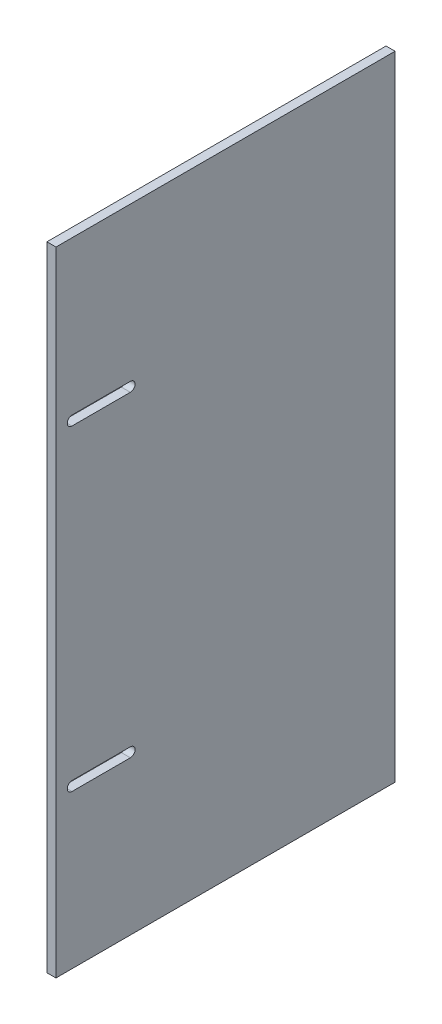
ISO-10303-21;
HEADER;
FILE_DESCRIPTION(('STEP AP214'),'2;1');
FILE_NAME('part.step','',(''),(''),'','','');
FILE_SCHEMA(('AUTOMOTIVE_DESIGN { 1 0 10303 214 1 1 1 1 }'));
ENDSEC;
DATA;
#1=APPLICATION_CONTEXT('core data for automotive mechanical design processes');
#2=APPLICATION_PROTOCOL_DEFINITION('international standard','automotive_design',2000,#1);
#3=PRODUCT_CONTEXT('',#1,'mechanical');
#4=PRODUCT('Part','Part','',(#3));
#5=PRODUCT_RELATED_PRODUCT_CATEGORY('part','',(#4));
#6=PRODUCT_DEFINITION_FORMATION('','',#4);
#7=PRODUCT_DEFINITION_CONTEXT('part definition',#1,'design');
#8=PRODUCT_DEFINITION('design','',#6,#7);
#9=PRODUCT_DEFINITION_SHAPE('','',#8);
#10=(LENGTH_UNIT() NAMED_UNIT(*) SI_UNIT(.MILLI.,.METRE.));
#11=(NAMED_UNIT(*) PLANE_ANGLE_UNIT() SI_UNIT($,.RADIAN.));
#12=(NAMED_UNIT(*) SI_UNIT($,.STERADIAN.) SOLID_ANGLE_UNIT());
#13=UNCERTAINTY_MEASURE_WITH_UNIT(LENGTH_MEASURE(1.E-05),#10,'distance_accuracy_value','');
#14=(GEOMETRIC_REPRESENTATION_CONTEXT(3) GLOBAL_UNCERTAINTY_ASSIGNED_CONTEXT((#13)) GLOBAL_UNIT_ASSIGNED_CONTEXT((#10,
#11,#12)) REPRESENTATION_CONTEXT('',''));
#15=CARTESIAN_POINT('',(0.,0.,0.));
#16=DIRECTION('',(0.,0.,1.));
#17=DIRECTION('',(1.,0.,0.));
#18=AXIS2_PLACEMENT_3D('',#15,#16,#17);
#19=CARTESIAN_POINT('',(4.,0.,0.));
#20=DIRECTION('',(1.,0.,0.));
#21=DIRECTION('',(0.,0.,-1.));
#22=AXIS2_PLACEMENT_3D('',#19,#20,#21);
#23=PLANE('',#22);
#24=DIRECTION('',(0.,0.,-1.));
#25=VECTOR('',#24,1.);
#26=CARTESIAN_POINT('',(4.,0.,150.));
#27=LINE('',#26,#25);
#28=CARTESIAN_POINT('',(4.,0.,150.));
#29=VERTEX_POINT('',#28);
#30=CARTESIAN_POINT('',(4.,0.,0.));
#31=VERTEX_POINT('',#30);
#32=EDGE_CURVE('E195',#29,#31,#27,.T.);
#33=ORIENTED_EDGE('',*,*,#32,.T.);
#34=DIRECTION('',(0.,1.,0.));
#35=VECTOR('',#34,1.);
#36=CARTESIAN_POINT('',(4.,0.,0.));
#37=LINE('',#36,#35);
#38=CARTESIAN_POINT('',(4.,280.,0.));
#39=VERTEX_POINT('',#38);
#40=EDGE_CURVE('E198',#31,#39,#37,.T.);
#41=ORIENTED_EDGE('',*,*,#40,.T.);
#42=DIRECTION('',(0.,0.,1.));
#43=VECTOR('',#42,1.);
#44=CARTESIAN_POINT('',(4.,280.,0.));
#45=LINE('',#44,#43);
#46=CARTESIAN_POINT('',(4.,280.,150.));
#47=VERTEX_POINT('',#46);
#48=EDGE_CURVE('E201',#39,#47,#45,.T.);
#49=ORIENTED_EDGE('',*,*,#48,.T.);
#50=DIRECTION('',(0.,-1.,0.));
#51=VECTOR('',#50,1.);
#52=CARTESIAN_POINT('',(4.,280.,150.));
#53=LINE('',#52,#51);
#54=EDGE_CURVE('E203',#47,#29,#53,.T.);
#55=ORIENTED_EDGE('',*,*,#54,.T.);
#56=EDGE_LOOP('',(#33,#41,#49,#55));
#57=FACE_BOUND('',#56,.T.);
#58=DIRECTION('',(0.,0.,-1.));
#59=VECTOR('',#58,1.);
#60=CARTESIAN_POINT('',(4.,67.9,142.9));
#61=LINE('',#60,#59);
#62=CARTESIAN_POINT('',(4.,67.9,142.9));
#63=VERTEX_POINT('',#62);
#64=CARTESIAN_POINT('',(4.,67.9,117.1));
#65=VERTEX_POINT('',#64);
#66=EDGE_CURVE('E166',#63,#65,#61,.T.);
#67=ORIENTED_EDGE('',*,*,#66,.F.);
#68=CARTESIAN_POINT('',(4.,70.,142.9));
#69=DIRECTION('',(1.,0.,0.));
#70=DIRECTION('',(0.,0.,1.));
#71=AXIS2_PLACEMENT_3D('',#68,#69,#70);
#72=CIRCLE('',#71,2.10000000000005);
#73=CARTESIAN_POINT('',(4.,72.1000000000001,142.9));
#74=VERTEX_POINT('',#73);
#75=EDGE_CURVE('E164',#74,#63,#72,.T.);
#76=ORIENTED_EDGE('',*,*,#75,.F.);
#77=DIRECTION('',(0.,0.,1.));
#78=VECTOR('',#77,1.);
#79=CARTESIAN_POINT('',(4.,72.1000000000001,142.9));
#80=LINE('',#79,#78);
#81=CARTESIAN_POINT('',(4.,72.1,117.1));
#82=VERTEX_POINT('',#81);
#83=EDGE_CURVE('E172',#82,#74,#80,.T.);
#84=ORIENTED_EDGE('',*,*,#83,.F.);
#85=CARTESIAN_POINT('',(4.,70.,117.1));
#86=DIRECTION('',(1.,0.,0.));
#87=DIRECTION('',(0.,0.,1.));
#88=AXIS2_PLACEMENT_3D('',#85,#86,#87);
#89=CIRCLE('',#88,2.10000000000002);
#90=EDGE_CURVE('E169',#65,#82,#89,.T.);
#91=ORIENTED_EDGE('',*,*,#90,.F.);
#92=EDGE_LOOP('',(#67,#76,#84,#91));
#93=FACE_BOUND('',#92,.T.);
#94=DIRECTION('',(0.,0.,-1.));
#95=VECTOR('',#94,1.);
#96=CARTESIAN_POINT('',(4.,207.9,142.9));
#97=LINE('',#96,#95);
#98=CARTESIAN_POINT('',(4.,207.9,142.9));
#99=VERTEX_POINT('',#98);
#100=CARTESIAN_POINT('',(4.,207.9,117.1));
#101=VERTEX_POINT('',#100);
#102=EDGE_CURVE('E136',#99,#101,#97,.T.);
#103=ORIENTED_EDGE('',*,*,#102,.F.);
#104=CARTESIAN_POINT('',(4.,210.,142.9));
#105=DIRECTION('',(1.,0.,0.));
#106=DIRECTION('',(0.,0.,-1.));
#107=AXIS2_PLACEMENT_3D('',#104,#105,#106);
#108=CIRCLE('',#107,2.10000000000005);
#109=CARTESIAN_POINT('',(4.,212.1,142.9));
#110=VERTEX_POINT('',#109);
#111=EDGE_CURVE('E128',#110,#99,#108,.T.);
#112=ORIENTED_EDGE('',*,*,#111,.F.);
#113=DIRECTION('',(0.,0.,1.));
#114=VECTOR('',#113,1.);
#115=CARTESIAN_POINT('',(4.,212.1,142.9));
#116=LINE('',#115,#114);
#117=CARTESIAN_POINT('',(4.,212.1,117.1));
#118=VERTEX_POINT('',#117);
#119=EDGE_CURVE('E150',#118,#110,#116,.T.);
#120=ORIENTED_EDGE('',*,*,#119,.F.);
#121=CARTESIAN_POINT('',(4.,210.,117.1));
#122=DIRECTION('',(1.,0.,0.));
#123=DIRECTION('',(0.,0.,-1.));
#124=AXIS2_PLACEMENT_3D('',#121,#122,#123);
#125=CIRCLE('',#124,2.10000000000002);
#126=EDGE_CURVE('E148',#101,#118,#125,.T.);
#127=ORIENTED_EDGE('',*,*,#126,.F.);
#128=EDGE_LOOP('',(#103,#112,#120,#127));
#129=FACE_BOUND('',#128,.T.);
#130=ADVANCED_FACE('F39',(#57,#93,#129),#23,.T.);
#131=CARTESIAN_POINT('',(0.,0.,0.));
#132=DIRECTION('',(1.,0.,0.));
#133=DIRECTION('',(0.,0.,-1.));
#134=AXIS2_PLACEMENT_3D('',#131,#132,#133);
#135=PLANE('',#134);
#136=CARTESIAN_POINT('',(0.,70.,142.9));
#137=DIRECTION('',(1.,0.,0.));
#138=DIRECTION('',(0.,0.,1.));
#139=AXIS2_PLACEMENT_3D('',#136,#137,#138);
#140=CIRCLE('',#139,2.10000000000005);
#141=CARTESIAN_POINT('',(0.,72.1000000000001,142.9));
#142=VERTEX_POINT('',#141);
#143=CARTESIAN_POINT('',(0.,67.9,142.9));
#144=VERTEX_POINT('',#143);
#145=EDGE_CURVE('E144',#142,#144,#140,.T.);
#146=ORIENTED_EDGE('',*,*,#145,.T.);
#147=DIRECTION('',(0.,0.,-1.));
#148=VECTOR('',#147,1.);
#149=CARTESIAN_POINT('',(0.,67.9,142.9));
#150=LINE('',#149,#148);
#151=CARTESIAN_POINT('',(0.,67.9,117.1));
#152=VERTEX_POINT('',#151);
#153=EDGE_CURVE('E177',#144,#152,#150,.T.);
#154=ORIENTED_EDGE('',*,*,#153,.T.);
#155=CARTESIAN_POINT('',(0.,70.,117.1));
#156=DIRECTION('',(1.,0.,0.));
#157=DIRECTION('',(0.,0.,1.));
#158=AXIS2_PLACEMENT_3D('',#155,#156,#157);
#159=CIRCLE('',#158,2.10000000000002);
#160=CARTESIAN_POINT('',(0.,72.1,117.1));
#161=VERTEX_POINT('',#160);
#162=EDGE_CURVE('E180',#152,#161,#159,.T.);
#163=ORIENTED_EDGE('',*,*,#162,.T.);
#164=DIRECTION('',(0.,0.,1.));
#165=VECTOR('',#164,1.);
#166=CARTESIAN_POINT('',(0.,72.1000000000001,142.9));
#167=LINE('',#166,#165);
#168=EDGE_CURVE('E167',#161,#142,#167,.T.);
#169=ORIENTED_EDGE('',*,*,#168,.T.);
#170=EDGE_LOOP('',(#146,#154,#163,#169));
#171=FACE_BOUND('',#170,.T.);
#172=DIRECTION('',(0.,0.,-1.));
#173=VECTOR('',#172,1.);
#174=CARTESIAN_POINT('',(0.,0.,150.));
#175=LINE('',#174,#173);
#176=CARTESIAN_POINT('',(0.,0.,150.));
#177=VERTEX_POINT('',#176);
#178=CARTESIAN_POINT('',(0.,0.,0.));
#179=VERTEX_POINT('',#178);
#180=EDGE_CURVE('E194',#177,#179,#175,.T.);
#181=ORIENTED_EDGE('',*,*,#180,.F.);
#182=DIRECTION('',(0.,-1.,0.));
#183=VECTOR('',#182,1.);
#184=CARTESIAN_POINT('',(0.,280.,150.));
#185=LINE('',#184,#183);
#186=CARTESIAN_POINT('',(0.,280.,150.));
#187=VERTEX_POINT('',#186);
#188=EDGE_CURVE('E199',#187,#177,#185,.T.);
#189=ORIENTED_EDGE('',*,*,#188,.F.);
#190=DIRECTION('',(0.,0.,1.));
#191=VECTOR('',#190,1.);
#192=CARTESIAN_POINT('',(0.,280.,0.));
#193=LINE('',#192,#191);
#194=CARTESIAN_POINT('',(0.,280.,0.));
#195=VERTEX_POINT('',#194);
#196=EDGE_CURVE('E210',#195,#187,#193,.T.);
#197=ORIENTED_EDGE('',*,*,#196,.F.);
#198=DIRECTION('',(0.,1.,0.));
#199=VECTOR('',#198,1.);
#200=CARTESIAN_POINT('',(0.,0.,0.));
#201=LINE('',#200,#199);
#202=EDGE_CURVE('E208',#179,#195,#201,.T.);
#203=ORIENTED_EDGE('',*,*,#202,.F.);
#204=EDGE_LOOP('',(#181,#189,#197,#203));
#205=FACE_BOUND('',#204,.T.);
#206=CARTESIAN_POINT('',(0.,210.,142.9));
#207=DIRECTION('',(1.,0.,0.));
#208=DIRECTION('',(0.,0.,-1.));
#209=AXIS2_PLACEMENT_3D('',#206,#207,#208);
#210=CIRCLE('',#209,2.10000000000005);
#211=CARTESIAN_POINT('',(0.,212.1,142.9));
#212=VERTEX_POINT('',#211);
#213=CARTESIAN_POINT('',(0.,207.9,142.9));
#214=VERTEX_POINT('',#213);
#215=EDGE_CURVE('E62',#212,#214,#210,.T.);
#216=ORIENTED_EDGE('',*,*,#215,.T.);
#217=DIRECTION('',(0.,0.,-1.));
#218=VECTOR('',#217,1.);
#219=CARTESIAN_POINT('',(0.,207.9,142.9));
#220=LINE('',#219,#218);
#221=CARTESIAN_POINT('',(0.,207.9,117.1));
#222=VERTEX_POINT('',#221);
#223=EDGE_CURVE('E143',#214,#222,#220,.T.);
#224=ORIENTED_EDGE('',*,*,#223,.T.);
#225=CARTESIAN_POINT('',(0.,210.,117.1));
#226=DIRECTION('',(1.,0.,0.));
#227=DIRECTION('',(0.,0.,-1.));
#228=AXIS2_PLACEMENT_3D('',#225,#226,#227);
#229=CIRCLE('',#228,2.10000000000002);
#230=CARTESIAN_POINT('',(0.,212.1,117.1));
#231=VERTEX_POINT('',#230);
#232=EDGE_CURVE('E156',#222,#231,#229,.T.);
#233=ORIENTED_EDGE('',*,*,#232,.T.);
#234=DIRECTION('',(0.,0.,1.));
#235=VECTOR('',#234,1.);
#236=CARTESIAN_POINT('',(0.,212.1,142.9));
#237=LINE('',#236,#235);
#238=EDGE_CURVE('E137',#231,#212,#237,.T.);
#239=ORIENTED_EDGE('',*,*,#238,.T.);
#240=EDGE_LOOP('',(#216,#224,#233,#239));
#241=FACE_BOUND('',#240,.T.);
#242=ADVANCED_FACE('F228',(#171,#205,#241),#135,.F.);
#243=CARTESIAN_POINT('',(4.,0.,150.));
#244=DIRECTION('',(0.,1.,0.));
#245=DIRECTION('',(0.,0.,1.));
#246=AXIS2_PLACEMENT_3D('',#243,#244,#245);
#247=PLANE('',#246);
#248=ORIENTED_EDGE('',*,*,#180,.T.);
#249=DIRECTION('',(-1.,0.,0.));
#250=VECTOR('',#249,1.);
#251=CARTESIAN_POINT('',(4.,0.,0.));
#252=LINE('',#251,#250);
#253=EDGE_CURVE('E11',#31,#179,#252,.T.);
#254=ORIENTED_EDGE('',*,*,#253,.F.);
#255=ORIENTED_EDGE('',*,*,#32,.F.);
#256=DIRECTION('',(-1.,0.,0.));
#257=VECTOR('',#256,1.);
#258=CARTESIAN_POINT('',(4.,0.,150.));
#259=LINE('',#258,#257);
#260=EDGE_CURVE('E205',#29,#177,#259,.T.);
#261=ORIENTED_EDGE('',*,*,#260,.T.);
#262=EDGE_LOOP('',(#248,#254,#255,#261));
#263=FACE_BOUND('',#262,.T.);
#264=ADVANCED_FACE('F41',(#263),#247,.F.);
#265=CARTESIAN_POINT('',(4.,0.,0.));
#266=DIRECTION('',(0.,0.,1.));
#267=DIRECTION('',(1.,0.,0.));
#268=AXIS2_PLACEMENT_3D('',#265,#266,#267);
#269=PLANE('',#268);
#270=ORIENTED_EDGE('',*,*,#202,.T.);
#271=DIRECTION('',(-1.,0.,0.));
#272=VECTOR('',#271,1.);
#273=CARTESIAN_POINT('',(4.,280.,0.));
#274=LINE('',#273,#272);
#275=EDGE_CURVE('E47',#39,#195,#274,.T.);
#276=ORIENTED_EDGE('',*,*,#275,.F.);
#277=ORIENTED_EDGE('',*,*,#40,.F.);
#278=ORIENTED_EDGE('',*,*,#253,.T.);
#279=EDGE_LOOP('',(#270,#276,#277,#278));
#280=FACE_BOUND('',#279,.T.);
#281=ADVANCED_FACE('F239',(#280),#269,.F.);
#282=CARTESIAN_POINT('',(4.,280.,0.));
#283=DIRECTION('',(0.,-1.,0.));
#284=DIRECTION('',(0.,0.,-1.));
#285=AXIS2_PLACEMENT_3D('',#282,#283,#284);
#286=PLANE('',#285);
#287=ORIENTED_EDGE('',*,*,#196,.T.);
#288=DIRECTION('',(-1.,0.,0.));
#289=VECTOR('',#288,1.);
#290=CARTESIAN_POINT('',(4.,280.,150.));
#291=LINE('',#290,#289);
#292=EDGE_CURVE('E215',#47,#187,#291,.T.);
#293=ORIENTED_EDGE('',*,*,#292,.F.);
#294=ORIENTED_EDGE('',*,*,#48,.F.);
#295=ORIENTED_EDGE('',*,*,#275,.T.);
#296=EDGE_LOOP('',(#287,#293,#294,#295));
#297=FACE_BOUND('',#296,.T.);
#298=ADVANCED_FACE('F222',(#297),#286,.F.);
#299=CARTESIAN_POINT('',(4.,280.,150.));
#300=DIRECTION('',(0.,0.,-1.));
#301=DIRECTION('',(0.,1.,0.));
#302=AXIS2_PLACEMENT_3D('',#299,#300,#301);
#303=PLANE('',#302);
#304=ORIENTED_EDGE('',*,*,#188,.T.);
#305=ORIENTED_EDGE('',*,*,#260,.F.);
#306=ORIENTED_EDGE('',*,*,#54,.F.);
#307=ORIENTED_EDGE('',*,*,#292,.T.);
#308=EDGE_LOOP('',(#304,#305,#306,#307));
#309=FACE_BOUND('',#308,.T.);
#310=ADVANCED_FACE('F232',(#309),#303,.F.);
#311=CARTESIAN_POINT('',(4.,70.,142.9));
#312=DIRECTION('',(-1.,0.,0.));
#313=DIRECTION('',(0.,0.,1.));
#314=AXIS2_PLACEMENT_3D('',#311,#312,#313);
#315=CYLINDRICAL_SURFACE('',#314,2.10000000000005);
#316=ORIENTED_EDGE('',*,*,#145,.F.);
#317=DIRECTION('',(-1.,0.,0.));
#318=VECTOR('',#317,1.);
#319=CARTESIAN_POINT('',(4.,72.1000000000001,142.9));
#320=LINE('',#319,#318);
#321=EDGE_CURVE('E174',#74,#142,#320,.T.);
#322=ORIENTED_EDGE('',*,*,#321,.F.);
#323=ORIENTED_EDGE('',*,*,#75,.T.);
#324=DIRECTION('',(-1.,0.,0.));
#325=VECTOR('',#324,1.);
#326=CARTESIAN_POINT('',(4.,67.9,142.9));
#327=LINE('',#326,#325);
#328=EDGE_CURVE('E191',#63,#144,#327,.T.);
#329=ORIENTED_EDGE('',*,*,#328,.T.);
#330=EDGE_LOOP('',(#316,#322,#323,#329));
#331=FACE_BOUND('',#330,.T.);
#332=ADVANCED_FACE('F254',(#331),#315,.F.);
#333=CARTESIAN_POINT('',(4.,67.9,142.9));
#334=DIRECTION('',(0.,1.,0.));
#335=DIRECTION('',(0.,0.,1.));
#336=AXIS2_PLACEMENT_3D('',#333,#334,#335);
#337=PLANE('',#336);
#338=ORIENTED_EDGE('',*,*,#153,.F.);
#339=ORIENTED_EDGE('',*,*,#328,.F.);
#340=ORIENTED_EDGE('',*,*,#66,.T.);
#341=DIRECTION('',(-1.,0.,0.));
#342=VECTOR('',#341,1.);
#343=CARTESIAN_POINT('',(4.,67.9,117.1));
#344=LINE('',#343,#342);
#345=EDGE_CURVE('E189',#65,#152,#344,.T.);
#346=ORIENTED_EDGE('',*,*,#345,.T.);
#347=EDGE_LOOP('',(#338,#339,#340,#346));
#348=FACE_BOUND('',#347,.T.);
#349=ADVANCED_FACE('F261',(#348),#337,.T.);
#350=CARTESIAN_POINT('',(4.,70.,117.1));
#351=DIRECTION('',(-1.,0.,0.));
#352=DIRECTION('',(0.,0.,1.));
#353=AXIS2_PLACEMENT_3D('',#350,#351,#352);
#354=CYLINDRICAL_SURFACE('',#353,2.10000000000002);
#355=ORIENTED_EDGE('',*,*,#162,.F.);
#356=ORIENTED_EDGE('',*,*,#345,.F.);
#357=ORIENTED_EDGE('',*,*,#90,.T.);
#358=DIRECTION('',(-1.,0.,0.));
#359=VECTOR('',#358,1.);
#360=CARTESIAN_POINT('',(4.,72.1,117.1));
#361=LINE('',#360,#359);
#362=EDGE_CURVE('E187',#82,#161,#361,.T.);
#363=ORIENTED_EDGE('',*,*,#362,.T.);
#364=EDGE_LOOP('',(#355,#356,#357,#363));
#365=FACE_BOUND('',#364,.T.);
#366=ADVANCED_FACE('F266',(#365),#354,.F.);
#367=CARTESIAN_POINT('',(4.,72.1000000000001,142.9));
#368=DIRECTION('',(0.,-1.,0.));
#369=DIRECTION('',(0.,0.,-1.));
#370=AXIS2_PLACEMENT_3D('',#367,#368,#369);
#371=PLANE('',#370);
#372=ORIENTED_EDGE('',*,*,#168,.F.);
#373=ORIENTED_EDGE('',*,*,#362,.F.);
#374=ORIENTED_EDGE('',*,*,#83,.T.);
#375=ORIENTED_EDGE('',*,*,#321,.T.);
#376=EDGE_LOOP('',(#372,#373,#374,#375));
#377=FACE_BOUND('',#376,.T.);
#378=ADVANCED_FACE('F273',(#377),#371,.T.);
#379=CARTESIAN_POINT('',(4.,210.,142.9));
#380=DIRECTION('',(-1.,0.,0.));
#381=DIRECTION('',(0.,0.,1.));
#382=AXIS2_PLACEMENT_3D('',#379,#380,#381);
#383=CYLINDRICAL_SURFACE('',#382,2.10000000000005);
#384=ORIENTED_EDGE('',*,*,#215,.F.);
#385=DIRECTION('',(-1.,0.,0.));
#386=VECTOR('',#385,1.);
#387=CARTESIAN_POINT('',(4.,212.1,142.9));
#388=LINE('',#387,#386);
#389=EDGE_CURVE('E132',#110,#212,#388,.T.);
#390=ORIENTED_EDGE('',*,*,#389,.F.);
#391=ORIENTED_EDGE('',*,*,#111,.T.);
#392=DIRECTION('',(-1.,0.,0.));
#393=VECTOR('',#392,1.);
#394=CARTESIAN_POINT('',(4.,207.9,142.9));
#395=LINE('',#394,#393);
#396=EDGE_CURVE('E131',#99,#214,#395,.T.);
#397=ORIENTED_EDGE('',*,*,#396,.T.);
#398=EDGE_LOOP('',(#384,#390,#391,#397));
#399=FACE_BOUND('',#398,.T.);
#400=ADVANCED_FACE('F130',(#399),#383,.F.);
#401=CARTESIAN_POINT('',(4.,207.9,142.9));
#402=DIRECTION('',(0.,1.,0.));
#403=DIRECTION('',(0.,0.,1.));
#404=AXIS2_PLACEMENT_3D('',#401,#402,#403);
#405=PLANE('',#404);
#406=ORIENTED_EDGE('',*,*,#223,.F.);
#407=ORIENTED_EDGE('',*,*,#396,.F.);
#408=ORIENTED_EDGE('',*,*,#102,.T.);
#409=DIRECTION('',(-1.,0.,0.));
#410=VECTOR('',#409,1.);
#411=CARTESIAN_POINT('',(4.,207.9,117.1));
#412=LINE('',#411,#410);
#413=EDGE_CURVE('E145',#101,#222,#412,.T.);
#414=ORIENTED_EDGE('',*,*,#413,.T.);
#415=EDGE_LOOP('',(#406,#407,#408,#414));
#416=FACE_BOUND('',#415,.T.);
#417=ADVANCED_FACE('F140',(#416),#405,.T.);
#418=CARTESIAN_POINT('',(4.,210.,117.1));
#419=DIRECTION('',(-1.,0.,0.));
#420=DIRECTION('',(0.,0.,1.));
#421=AXIS2_PLACEMENT_3D('',#418,#419,#420);
#422=CYLINDRICAL_SURFACE('',#421,2.10000000000002);
#423=ORIENTED_EDGE('',*,*,#232,.F.);
#424=ORIENTED_EDGE('',*,*,#413,.F.);
#425=ORIENTED_EDGE('',*,*,#126,.T.);
#426=DIRECTION('',(-1.,0.,0.));
#427=VECTOR('',#426,1.);
#428=CARTESIAN_POINT('',(4.,212.1,117.1));
#429=LINE('',#428,#427);
#430=EDGE_CURVE('E54',#118,#231,#429,.T.);
#431=ORIENTED_EDGE('',*,*,#430,.T.);
#432=EDGE_LOOP('',(#423,#424,#425,#431));
#433=FACE_BOUND('',#432,.T.);
#434=ADVANCED_FACE('F291',(#433),#422,.F.);
#435=CARTESIAN_POINT('',(4.,212.1,142.9));
#436=DIRECTION('',(0.,-1.,0.));
#437=DIRECTION('',(0.,0.,-1.));
#438=AXIS2_PLACEMENT_3D('',#435,#436,#437);
#439=PLANE('',#438);
#440=ORIENTED_EDGE('',*,*,#238,.F.);
#441=ORIENTED_EDGE('',*,*,#430,.F.);
#442=ORIENTED_EDGE('',*,*,#119,.T.);
#443=ORIENTED_EDGE('',*,*,#389,.T.);
#444=EDGE_LOOP('',(#440,#441,#442,#443));
#445=FACE_BOUND('',#444,.T.);
#446=ADVANCED_FACE('F294',(#445),#439,.T.);
#447=CLOSED_SHELL('',(#130,#242,#264,#281,#298,#310,#332,#349,#366,#378,#400,#417,#434,#446));
#448=MANIFOLD_SOLID_BREP('B2',#447);
#449=ADVANCED_BREP_SHAPE_REPRESENTATION('',(#18,#448),#14);
#450=SHAPE_DEFINITION_REPRESENTATION(#9,#449);
ENDSEC;
END-ISO-10303-21;
